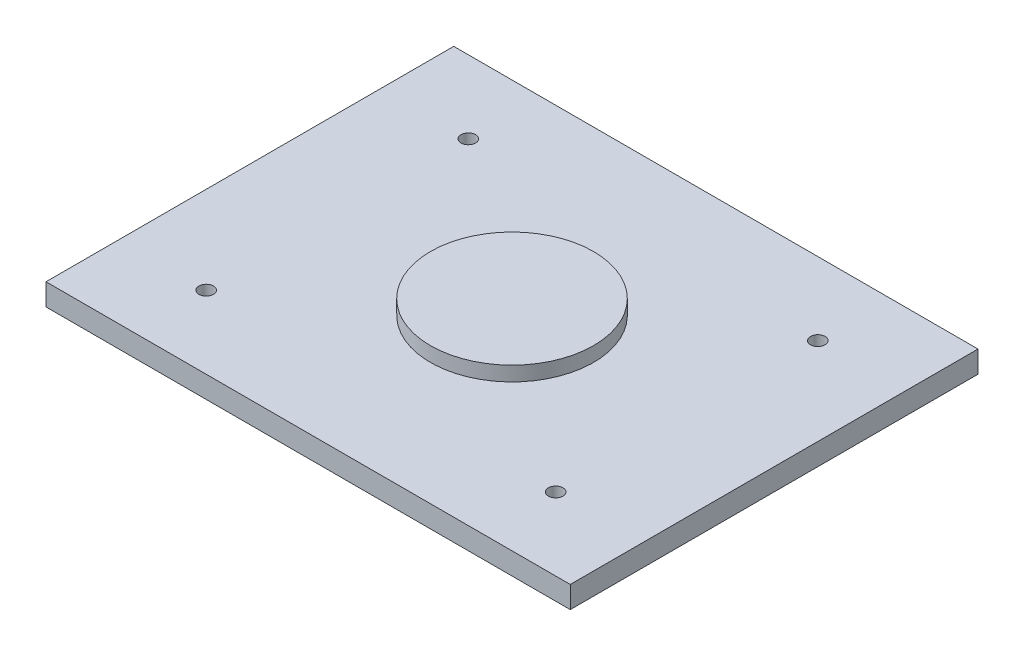
ISO-10303-21;
HEADER;
FILE_DESCRIPTION(('STEP AP214'),'2;1');
FILE_NAME('part.step','',(''),(''),'','','');
FILE_SCHEMA(('AUTOMOTIVE_DESIGN { 1 0 10303 214 1 1 1 1 }'));
ENDSEC;
DATA;
#1=APPLICATION_CONTEXT('core data for automotive mechanical design processes');
#2=APPLICATION_PROTOCOL_DEFINITION('international standard','automotive_design',2000,#1);
#3=PRODUCT_CONTEXT('',#1,'mechanical');
#4=PRODUCT('Part','Part','',(#3));
#5=PRODUCT_RELATED_PRODUCT_CATEGORY('part','',(#4));
#6=PRODUCT_DEFINITION_FORMATION('','',#4);
#7=PRODUCT_DEFINITION_CONTEXT('part definition',#1,'design');
#8=PRODUCT_DEFINITION('design','',#6,#7);
#9=PRODUCT_DEFINITION_SHAPE('','',#8);
#10=(LENGTH_UNIT() NAMED_UNIT(*) SI_UNIT(.MILLI.,.METRE.));
#11=(NAMED_UNIT(*) PLANE_ANGLE_UNIT() SI_UNIT($,.RADIAN.));
#12=(NAMED_UNIT(*) SI_UNIT($,.STERADIAN.) SOLID_ANGLE_UNIT());
#13=UNCERTAINTY_MEASURE_WITH_UNIT(LENGTH_MEASURE(1.E-05),#10,'distance_accuracy_value','');
#14=(GEOMETRIC_REPRESENTATION_CONTEXT(3) GLOBAL_UNCERTAINTY_ASSIGNED_CONTEXT((#13)) GLOBAL_UNIT_ASSIGNED_CONTEXT((#10,
#11,#12)) REPRESENTATION_CONTEXT('',''));
#15=CARTESIAN_POINT('',(0.,0.,0.));
#16=DIRECTION('',(0.,0.,1.));
#17=DIRECTION('',(1.,0.,0.));
#18=AXIS2_PLACEMENT_3D('',#15,#16,#17);
#19=CARTESIAN_POINT('',(114.3,9.525,-88.9));
#20=DIRECTION('',(0.,-1.,0.));
#21=DIRECTION('',(0.,0.,-1.));
#22=AXIS2_PLACEMENT_3D('',#19,#20,#21);
#23=PLANE('',#22);
#24=DIRECTION('',(0.,0.,-1.));
#25=VECTOR('',#24,1.);
#26=CARTESIAN_POINT('',(114.3,9.525,88.9));
#27=LINE('',#26,#25);
#28=CARTESIAN_POINT('',(114.3,9.525,88.9));
#29=VERTEX_POINT('',#28);
#30=CARTESIAN_POINT('',(114.3,9.525,-88.9));
#31=VERTEX_POINT('',#30);
#32=EDGE_CURVE('E84',#29,#31,#27,.T.);
#33=ORIENTED_EDGE('',*,*,#32,.T.);
#34=DIRECTION('',(-1.,0.,0.));
#35=VECTOR('',#34,1.);
#36=CARTESIAN_POINT('',(-114.3,9.525,-88.9));
#37=LINE('',#36,#35);
#38=CARTESIAN_POINT('',(-114.3,9.525,-88.9));
#39=VERTEX_POINT('',#38);
#40=EDGE_CURVE('E79',#31,#39,#37,.T.);
#41=ORIENTED_EDGE('',*,*,#40,.T.);
#42=DIRECTION('',(0.,0.,1.));
#43=VECTOR('',#42,1.);
#44=CARTESIAN_POINT('',(-114.3,9.525,88.9));
#45=LINE('',#44,#43);
#46=CARTESIAN_POINT('',(-114.3,9.525,88.9));
#47=VERTEX_POINT('',#46);
#48=EDGE_CURVE('E82',#39,#47,#45,.T.);
#49=ORIENTED_EDGE('',*,*,#48,.T.);
#50=DIRECTION('',(1.,0.,0.));
#51=VECTOR('',#50,1.);
#52=CARTESIAN_POINT('',(-114.3,9.525,88.9));
#53=LINE('',#52,#51);
#54=EDGE_CURVE('E48',#47,#29,#53,.T.);
#55=ORIENTED_EDGE('',*,*,#54,.T.);
#56=EDGE_LOOP('',(#33,#41,#49,#55));
#57=FACE_BOUND('',#56,.T.);
#58=CARTESIAN_POINT('',(76.2,9.525,-57.15));
#59=DIRECTION('',(0.,1.,0.));
#60=DIRECTION('',(0.,0.,1.));
#61=AXIS2_PLACEMENT_3D('',#58,#59,#60);
#62=CIRCLE('',#61,3.17499999999998);
#63=CARTESIAN_POINT('',(76.2,9.525,-53.975));
#64=VERTEX_POINT('',#63);
#65=EDGE_CURVE('E173',#64,#64,#62,.T.);
#66=ORIENTED_EDGE('',*,*,#65,.F.);
#67=EDGE_LOOP('',(#66));
#68=FACE_BOUND('',#67,.T.);
#69=CARTESIAN_POINT('',(76.2,9.525,57.15));
#70=DIRECTION('',(0.,1.,0.));
#71=DIRECTION('',(0.,0.,1.));
#72=AXIS2_PLACEMENT_3D('',#69,#70,#71);
#73=CIRCLE('',#72,3.17499999999998);
#74=CARTESIAN_POINT('',(76.2,9.525,60.325));
#75=VERTEX_POINT('',#74);
#76=EDGE_CURVE('E167',#75,#75,#73,.T.);
#77=ORIENTED_EDGE('',*,*,#76,.F.);
#78=EDGE_LOOP('',(#77));
#79=FACE_BOUND('',#78,.T.);
#80=CARTESIAN_POINT('',(-76.2,9.525,57.15));
#81=DIRECTION('',(0.,1.,0.));
#82=DIRECTION('',(0.,0.,1.));
#83=AXIS2_PLACEMENT_3D('',#80,#81,#82);
#84=CIRCLE('',#83,3.17499999999998);
#85=CARTESIAN_POINT('',(-76.2,9.525,60.325));
#86=VERTEX_POINT('',#85);
#87=EDGE_CURVE('E161',#86,#86,#84,.T.);
#88=ORIENTED_EDGE('',*,*,#87,.F.);
#89=EDGE_LOOP('',(#88));
#90=FACE_BOUND('',#89,.T.);
#91=CARTESIAN_POINT('',(-76.2,9.525,-57.15));
#92=DIRECTION('',(0.,1.,0.));
#93=DIRECTION('',(0.,0.,1.));
#94=AXIS2_PLACEMENT_3D('',#91,#92,#93);
#95=CIRCLE('',#94,3.17499999999998);
#96=CARTESIAN_POINT('',(-76.2,9.525,-53.975));
#97=VERTEX_POINT('',#96);
#98=EDGE_CURVE('E154',#97,#97,#95,.T.);
#99=ORIENTED_EDGE('',*,*,#98,.F.);
#100=EDGE_LOOP('',(#99));
#101=FACE_BOUND('',#100,.T.);
#102=CARTESIAN_POINT('',(0.,9.525,0.));
#103=DIRECTION('',(0.,-1.,0.));
#104=DIRECTION('',(0.,0.,-1.));
#105=AXIS2_PLACEMENT_3D('',#102,#103,#104);
#106=CIRCLE('',#105,35.56);
#107=CARTESIAN_POINT('',(0.,9.525,-35.56));
#108=VERTEX_POINT('',#107);
#109=EDGE_CURVE('E11',#108,#108,#106,.F.);
#110=ORIENTED_EDGE('',*,*,#109,.F.);
#111=EDGE_LOOP('',(#110));
#112=FACE_BOUND('',#111,.T.);
#113=ADVANCED_FACE('F31',(#57,#68,#79,#90,#101,#112),#23,.F.);
#114=CARTESIAN_POINT('',(114.3,9.525,88.9));
#115=DIRECTION('',(-1.,0.,0.));
#116=DIRECTION('',(0.,0.,1.));
#117=AXIS2_PLACEMENT_3D('',#114,#115,#116);
#118=PLANE('',#117);
#119=DIRECTION('',(0.,0.,-1.));
#120=VECTOR('',#119,1.);
#121=CARTESIAN_POINT('',(114.3,0.,88.9));
#122=LINE('',#121,#120);
#123=CARTESIAN_POINT('',(114.3,0.,88.9));
#124=VERTEX_POINT('',#123);
#125=CARTESIAN_POINT('',(114.3,0.,-88.9));
#126=VERTEX_POINT('',#125);
#127=EDGE_CURVE('E98',#124,#126,#122,.T.);
#128=ORIENTED_EDGE('',*,*,#127,.T.);
#129=DIRECTION('',(0.,-1.,0.));
#130=VECTOR('',#129,1.);
#131=CARTESIAN_POINT('',(114.3,9.525,-88.9));
#132=LINE('',#131,#130);
#133=EDGE_CURVE('E40',#31,#126,#132,.T.);
#134=ORIENTED_EDGE('',*,*,#133,.F.);
#135=ORIENTED_EDGE('',*,*,#32,.F.);
#136=DIRECTION('',(0.,-1.,0.));
#137=VECTOR('',#136,1.);
#138=CARTESIAN_POINT('',(114.3,9.525,88.9));
#139=LINE('',#138,#137);
#140=EDGE_CURVE('E94',#29,#124,#139,.T.);
#141=ORIENTED_EDGE('',*,*,#140,.T.);
#142=EDGE_LOOP('',(#128,#134,#135,#141));
#143=FACE_BOUND('',#142,.T.);
#144=ADVANCED_FACE('F33',(#143),#118,.F.);
#145=CARTESIAN_POINT('',(-114.3,9.525,-88.9));
#146=DIRECTION('',(0.,0.,1.));
#147=DIRECTION('',(1.,0.,0.));
#148=AXIS2_PLACEMENT_3D('',#145,#146,#147);
#149=PLANE('',#148);
#150=DIRECTION('',(-1.,0.,0.));
#151=VECTOR('',#150,1.);
#152=CARTESIAN_POINT('',(-114.3,0.,-88.9));
#153=LINE('',#152,#151);
#154=CARTESIAN_POINT('',(-114.3,0.,-88.9));
#155=VERTEX_POINT('',#154);
#156=EDGE_CURVE('E89',#126,#155,#153,.T.);
#157=ORIENTED_EDGE('',*,*,#156,.T.);
#158=DIRECTION('',(0.,-1.,0.));
#159=VECTOR('',#158,1.);
#160=CARTESIAN_POINT('',(-114.3,9.525,-88.9));
#161=LINE('',#160,#159);
#162=EDGE_CURVE('E87',#39,#155,#161,.T.);
#163=ORIENTED_EDGE('',*,*,#162,.F.);
#164=ORIENTED_EDGE('',*,*,#40,.F.);
#165=ORIENTED_EDGE('',*,*,#133,.T.);
#166=EDGE_LOOP('',(#157,#163,#164,#165));
#167=FACE_BOUND('',#166,.T.);
#168=ADVANCED_FACE('F88',(#167),#149,.F.);
#169=CARTESIAN_POINT('',(-114.3,9.525,88.9));
#170=DIRECTION('',(1.,0.,0.));
#171=DIRECTION('',(0.,0.,-1.));
#172=AXIS2_PLACEMENT_3D('',#169,#170,#171);
#173=PLANE('',#172);
#174=DIRECTION('',(0.,0.,1.));
#175=VECTOR('',#174,1.);
#176=CARTESIAN_POINT('',(-114.3,0.,88.9));
#177=LINE('',#176,#175);
#178=CARTESIAN_POINT('',(-114.3,0.,88.9));
#179=VERTEX_POINT('',#178);
#180=EDGE_CURVE('E65',#155,#179,#177,.T.);
#181=ORIENTED_EDGE('',*,*,#180,.T.);
#182=DIRECTION('',(0.,-1.,0.));
#183=VECTOR('',#182,1.);
#184=CARTESIAN_POINT('',(-114.3,9.525,88.9));
#185=LINE('',#184,#183);
#186=EDGE_CURVE('E90',#47,#179,#185,.T.);
#187=ORIENTED_EDGE('',*,*,#186,.F.);
#188=ORIENTED_EDGE('',*,*,#48,.F.);
#189=ORIENTED_EDGE('',*,*,#162,.T.);
#190=EDGE_LOOP('',(#181,#187,#188,#189));
#191=FACE_BOUND('',#190,.T.);
#192=ADVANCED_FACE('F92',(#191),#173,.F.);
#193=CARTESIAN_POINT('',(-114.3,9.525,88.9));
#194=DIRECTION('',(0.,0.,-1.));
#195=DIRECTION('',(-1.,0.,0.));
#196=AXIS2_PLACEMENT_3D('',#193,#194,#195);
#197=PLANE('',#196);
#198=DIRECTION('',(1.,0.,0.));
#199=VECTOR('',#198,1.);
#200=CARTESIAN_POINT('',(-114.3,0.,88.9));
#201=LINE('',#200,#199);
#202=EDGE_CURVE('E71',#179,#124,#201,.T.);
#203=ORIENTED_EDGE('',*,*,#202,.T.);
#204=ORIENTED_EDGE('',*,*,#140,.F.);
#205=ORIENTED_EDGE('',*,*,#54,.F.);
#206=ORIENTED_EDGE('',*,*,#186,.T.);
#207=EDGE_LOOP('',(#203,#204,#205,#206));
#208=FACE_BOUND('',#207,.T.);
#209=ADVANCED_FACE('F112',(#208),#197,.F.);
#210=CARTESIAN_POINT('',(114.3,0.,-88.9));
#211=DIRECTION('',(0.,-1.,0.));
#212=DIRECTION('',(0.,0.,-1.));
#213=AXIS2_PLACEMENT_3D('',#210,#211,#212);
#214=PLANE('',#213);
#215=CARTESIAN_POINT('',(-76.2,0.,-57.15));
#216=DIRECTION('',(0.,1.,0.));
#217=DIRECTION('',(0.,0.,1.));
#218=AXIS2_PLACEMENT_3D('',#215,#216,#217);
#219=CIRCLE('',#218,3.175);
#220=CARTESIAN_POINT('',(-76.2,0.,-53.975));
#221=VERTEX_POINT('',#220);
#222=EDGE_CURVE('E157',#221,#221,#219,.T.);
#223=ORIENTED_EDGE('',*,*,#222,.T.);
#224=EDGE_LOOP('',(#223));
#225=FACE_BOUND('',#224,.T.);
#226=CARTESIAN_POINT('',(-76.2,0.,57.15));
#227=DIRECTION('',(0.,1.,0.));
#228=DIRECTION('',(0.,0.,1.));
#229=AXIS2_PLACEMENT_3D('',#226,#227,#228);
#230=CIRCLE('',#229,3.175);
#231=CARTESIAN_POINT('',(-76.2,0.,60.325));
#232=VERTEX_POINT('',#231);
#233=EDGE_CURVE('E164',#232,#232,#230,.T.);
#234=ORIENTED_EDGE('',*,*,#233,.T.);
#235=EDGE_LOOP('',(#234));
#236=FACE_BOUND('',#235,.T.);
#237=CARTESIAN_POINT('',(76.2,0.,57.15));
#238=DIRECTION('',(0.,1.,0.));
#239=DIRECTION('',(0.,0.,1.));
#240=AXIS2_PLACEMENT_3D('',#237,#238,#239);
#241=CIRCLE('',#240,3.175);
#242=CARTESIAN_POINT('',(76.2,0.,60.325));
#243=VERTEX_POINT('',#242);
#244=EDGE_CURVE('E170',#243,#243,#241,.T.);
#245=ORIENTED_EDGE('',*,*,#244,.T.);
#246=EDGE_LOOP('',(#245));
#247=FACE_BOUND('',#246,.T.);
#248=CARTESIAN_POINT('',(76.2,0.,-57.15));
#249=DIRECTION('',(0.,1.,0.));
#250=DIRECTION('',(0.,0.,1.));
#251=AXIS2_PLACEMENT_3D('',#248,#249,#250);
#252=CIRCLE('',#251,3.175);
#253=CARTESIAN_POINT('',(76.2,0.,-53.975));
#254=VERTEX_POINT('',#253);
#255=EDGE_CURVE('E101',#254,#254,#252,.T.);
#256=ORIENTED_EDGE('',*,*,#255,.T.);
#257=EDGE_LOOP('',(#256));
#258=FACE_BOUND('',#257,.T.);
#259=ORIENTED_EDGE('',*,*,#127,.F.);
#260=ORIENTED_EDGE('',*,*,#202,.F.);
#261=ORIENTED_EDGE('',*,*,#180,.F.);
#262=ORIENTED_EDGE('',*,*,#156,.F.);
#263=EDGE_LOOP('',(#259,#260,#261,#262));
#264=FACE_BOUND('',#263,.T.);
#265=ADVANCED_FACE('F109',(#225,#236,#247,#258,#264),#214,.T.);
#266=CARTESIAN_POINT('',(76.2,9.525,-57.15));
#267=DIRECTION('',(0.,1.,0.));
#268=DIRECTION('',(0.,0.,1.));
#269=AXIS2_PLACEMENT_3D('',#266,#267,#268);
#270=CYLINDRICAL_SURFACE('',#269,3.17499999999999);
#271=ORIENTED_EDGE('',*,*,#255,.F.);
#272=EDGE_LOOP('',(#271));
#273=FACE_BOUND('',#272,.T.);
#274=ORIENTED_EDGE('',*,*,#65,.T.);
#275=EDGE_LOOP('',(#274));
#276=FACE_BOUND('',#275,.T.);
#277=ADVANCED_FACE('F111',(#273,#276),#270,.F.);
#278=CARTESIAN_POINT('',(76.2,9.525,57.15));
#279=DIRECTION('',(0.,1.,0.));
#280=DIRECTION('',(0.,0.,1.));
#281=AXIS2_PLACEMENT_3D('',#278,#279,#280);
#282=CYLINDRICAL_SURFACE('',#281,3.17499999999999);
#283=ORIENTED_EDGE('',*,*,#244,.F.);
#284=EDGE_LOOP('',(#283));
#285=FACE_BOUND('',#284,.T.);
#286=ORIENTED_EDGE('',*,*,#76,.T.);
#287=EDGE_LOOP('',(#286));
#288=FACE_BOUND('',#287,.T.);
#289=ADVANCED_FACE('F119',(#285,#288),#282,.F.);
#290=CARTESIAN_POINT('',(-76.2,9.525,57.15));
#291=DIRECTION('',(0.,1.,0.));
#292=DIRECTION('',(0.,0.,1.));
#293=AXIS2_PLACEMENT_3D('',#290,#291,#292);
#294=CYLINDRICAL_SURFACE('',#293,3.17499999999999);
#295=ORIENTED_EDGE('',*,*,#233,.F.);
#296=EDGE_LOOP('',(#295));
#297=FACE_BOUND('',#296,.T.);
#298=ORIENTED_EDGE('',*,*,#87,.T.);
#299=EDGE_LOOP('',(#298));
#300=FACE_BOUND('',#299,.T.);
#301=ADVANCED_FACE('F133',(#297,#300),#294,.F.);
#302=CARTESIAN_POINT('',(-76.2,9.525,-57.15));
#303=DIRECTION('',(0.,1.,0.));
#304=DIRECTION('',(0.,0.,1.));
#305=AXIS2_PLACEMENT_3D('',#302,#303,#304);
#306=CYLINDRICAL_SURFACE('',#305,3.17499999999999);
#307=ORIENTED_EDGE('',*,*,#222,.F.);
#308=EDGE_LOOP('',(#307));
#309=FACE_BOUND('',#308,.T.);
#310=ORIENTED_EDGE('',*,*,#98,.T.);
#311=EDGE_LOOP('',(#310));
#312=FACE_BOUND('',#311,.T.);
#313=ADVANCED_FACE('F137',(#309,#312),#306,.F.);
#314=CARTESIAN_POINT('',(0.,15.875,0.));
#315=DIRECTION('',(0.,-1.,0.));
#316=DIRECTION('',(0.,0.,-1.));
#317=AXIS2_PLACEMENT_3D('',#314,#315,#316);
#318=CYLINDRICAL_SURFACE('',#317,35.56);
#319=CARTESIAN_POINT('',(0.,15.875,0.));
#320=DIRECTION('',(0.,1.,0.));
#321=DIRECTION('',(0.,0.,1.));
#322=AXIS2_PLACEMENT_3D('',#319,#320,#321);
#323=CIRCLE('',#322,35.56);
#324=CARTESIAN_POINT('',(0.,15.875,35.56));
#325=VERTEX_POINT('',#324);
#326=EDGE_CURVE('E153',#325,#325,#323,.T.);
#327=ORIENTED_EDGE('',*,*,#326,.F.);
#328=EDGE_LOOP('',(#327));
#329=FACE_BOUND('',#328,.T.);
#330=ORIENTED_EDGE('',*,*,#109,.T.);
#331=EDGE_LOOP('',(#330));
#332=FACE_BOUND('',#331,.T.);
#333=ADVANCED_FACE('F141',(#329,#332),#318,.T.);
#334=CARTESIAN_POINT('',(0.,15.875,0.));
#335=DIRECTION('',(0.,1.,0.));
#336=DIRECTION('',(0.,0.,1.));
#337=AXIS2_PLACEMENT_3D('',#334,#335,#336);
#338=PLANE('',#337);
#339=ORIENTED_EDGE('',*,*,#326,.T.);
#340=EDGE_LOOP('',(#339));
#341=FACE_BOUND('',#340,.T.);
#342=ADVANCED_FACE('F145',(#341),#338,.T.);
#343=CLOSED_SHELL('',(#113,#144,#168,#192,#209,#265,#277,#289,#301,#313,#333,#342));
#344=MANIFOLD_SOLID_BREP('B2',#343);
#345=ADVANCED_BREP_SHAPE_REPRESENTATION('',(#18,#344),#14);
#346=SHAPE_DEFINITION_REPRESENTATION(#9,#345);
ENDSEC;
END-ISO-10303-21;
